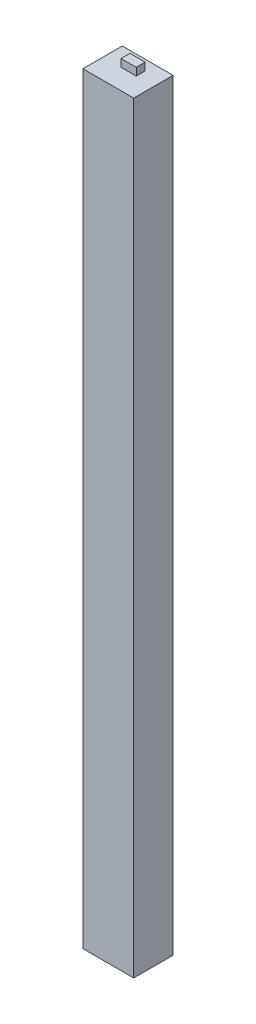
ISO-10303-21;
HEADER;
FILE_DESCRIPTION(('STEP AP214'),'2;1');
FILE_NAME('part.step','',(''),(''),'','','');
FILE_SCHEMA(('AUTOMOTIVE_DESIGN { 1 0 10303 214 1 1 1 1 }'));
ENDSEC;
DATA;
#1=APPLICATION_CONTEXT('core data for automotive mechanical design processes');
#2=APPLICATION_PROTOCOL_DEFINITION('international standard','automotive_design',2000,#1);
#3=PRODUCT_CONTEXT('',#1,'mechanical');
#4=PRODUCT('Part','Part','',(#3));
#5=PRODUCT_RELATED_PRODUCT_CATEGORY('part','',(#4));
#6=PRODUCT_DEFINITION_FORMATION('','',#4);
#7=PRODUCT_DEFINITION_CONTEXT('part definition',#1,'design');
#8=PRODUCT_DEFINITION('design','',#6,#7);
#9=PRODUCT_DEFINITION_SHAPE('','',#8);
#10=(LENGTH_UNIT() NAMED_UNIT(*) SI_UNIT(.MILLI.,.METRE.));
#11=(NAMED_UNIT(*) PLANE_ANGLE_UNIT() SI_UNIT($,.RADIAN.));
#12=(NAMED_UNIT(*) SI_UNIT($,.STERADIAN.) SOLID_ANGLE_UNIT());
#13=UNCERTAINTY_MEASURE_WITH_UNIT(LENGTH_MEASURE(1.E-05),#10,'distance_accuracy_value','');
#14=(GEOMETRIC_REPRESENTATION_CONTEXT(3) GLOBAL_UNCERTAINTY_ASSIGNED_CONTEXT((#13)) GLOBAL_UNIT_ASSIGNED_CONTEXT((#10,
#11,#12)) REPRESENTATION_CONTEXT('',''));
#15=CARTESIAN_POINT('',(0.,0.,0.));
#16=DIRECTION('',(0.,0.,1.));
#17=DIRECTION('',(1.,0.,0.));
#18=AXIS2_PLACEMENT_3D('',#15,#16,#17);
#19=CARTESIAN_POINT('',(-10.,150.,15.5));
#20=DIRECTION('',(0.,-1.,0.));
#21=DIRECTION('',(0.,0.,-1.));
#22=AXIS2_PLACEMENT_3D('',#19,#20,#21);
#23=PLANE('',#22);
#24=DIRECTION('',(-1.,0.,0.));
#25=VECTOR('',#24,1.);
#26=CARTESIAN_POINT('',(-10.,150.,0.));
#27=LINE('',#26,#25);
#28=CARTESIAN_POINT('',(10.,150.,0.));
#29=VERTEX_POINT('',#28);
#30=CARTESIAN_POINT('',(-10.,150.,0.));
#31=VERTEX_POINT('',#30);
#32=EDGE_CURVE('E120',#29,#31,#27,.T.);
#33=ORIENTED_EDGE('',*,*,#32,.T.);
#34=DIRECTION('',(0.,0.,-1.));
#35=VECTOR('',#34,1.);
#36=CARTESIAN_POINT('',(-10.,150.,15.5));
#37=LINE('',#36,#35);
#38=CARTESIAN_POINT('',(-10.,150.,15.5));
#39=VERTEX_POINT('',#38);
#40=EDGE_CURVE('E40',#39,#31,#37,.T.);
#41=ORIENTED_EDGE('',*,*,#40,.F.);
#42=DIRECTION('',(-1.,0.,0.));
#43=VECTOR('',#42,1.);
#44=CARTESIAN_POINT('',(-10.,150.,15.5));
#45=LINE('',#44,#43);
#46=CARTESIAN_POINT('',(10.,150.,15.5));
#47=VERTEX_POINT('',#46);
#48=EDGE_CURVE('E129',#47,#39,#45,.T.);
#49=ORIENTED_EDGE('',*,*,#48,.F.);
#50=DIRECTION('',(0.,0.,-1.));
#51=VECTOR('',#50,1.);
#52=CARTESIAN_POINT('',(10.,150.,15.5));
#53=LINE('',#52,#51);
#54=EDGE_CURVE('E11',#47,#29,#53,.T.);
#55=ORIENTED_EDGE('',*,*,#54,.T.);
#56=EDGE_LOOP('',(#33,#41,#49,#55));
#57=FACE_BOUND('',#56,.T.);
#58=DIRECTION('',(0.,0.,-1.));
#59=VECTOR('',#58,1.);
#60=CARTESIAN_POINT('',(3.,150.,4.));
#61=LINE('',#60,#59);
#62=CARTESIAN_POINT('',(3.,150.,7.5));
#63=VERTEX_POINT('',#62);
#64=CARTESIAN_POINT('',(3.,150.,4.));
#65=VERTEX_POINT('',#64);
#66=EDGE_CURVE('E47',#63,#65,#61,.T.);
#67=ORIENTED_EDGE('',*,*,#66,.F.);
#68=DIRECTION('',(1.,0.,0.));
#69=VECTOR('',#68,1.);
#70=CARTESIAN_POINT('',(-3.,150.,7.5));
#71=LINE('',#70,#69);
#72=CARTESIAN_POINT('',(-3.,150.,7.5));
#73=VERTEX_POINT('',#72);
#74=EDGE_CURVE('E51',#73,#63,#71,.T.);
#75=ORIENTED_EDGE('',*,*,#74,.F.);
#76=DIRECTION('',(0.,0.,1.));
#77=VECTOR('',#76,1.);
#78=CARTESIAN_POINT('',(-3.,150.,4.));
#79=LINE('',#78,#77);
#80=CARTESIAN_POINT('',(-3.,150.,4.));
#81=VERTEX_POINT('',#80);
#82=EDGE_CURVE('E259',#81,#73,#79,.T.);
#83=ORIENTED_EDGE('',*,*,#82,.F.);
#84=DIRECTION('',(-1.,0.,0.));
#85=VECTOR('',#84,1.);
#86=CARTESIAN_POINT('',(-3.,150.,4.));
#87=LINE('',#86,#85);
#88=EDGE_CURVE('E265',#65,#81,#87,.T.);
#89=ORIENTED_EDGE('',*,*,#88,.F.);
#90=EDGE_LOOP('',(#67,#75,#83,#89));
#91=FACE_BOUND('',#90,.T.);
#92=ADVANCED_FACE('F32',(#57,#91),#23,.F.);
#93=CARTESIAN_POINT('',(10.,150.,15.5));
#94=DIRECTION('',(-1.,0.,0.));
#95=DIRECTION('',(0.,-1.,0.));
#96=AXIS2_PLACEMENT_3D('',#93,#94,#95);
#97=PLANE('',#96);
#98=DIRECTION('',(0.,1.,0.));
#99=VECTOR('',#98,1.);
#100=CARTESIAN_POINT('',(10.,150.,0.));
#101=LINE('',#100,#99);
#102=CARTESIAN_POINT('',(10.,-150.,0.));
#103=VERTEX_POINT('',#102);
#104=EDGE_CURVE('E117',#103,#29,#101,.T.);
#105=ORIENTED_EDGE('',*,*,#104,.T.);
#106=ORIENTED_EDGE('',*,*,#54,.F.);
#107=DIRECTION('',(0.,1.,0.));
#108=VECTOR('',#107,1.);
#109=CARTESIAN_POINT('',(10.,150.,15.5));
#110=LINE('',#109,#108);
#111=CARTESIAN_POINT('',(10.,-150.,15.5));
#112=VERTEX_POINT('',#111);
#113=EDGE_CURVE('E126',#112,#47,#110,.T.);
#114=ORIENTED_EDGE('',*,*,#113,.F.);
#115=DIRECTION('',(0.,0.,-1.));
#116=VECTOR('',#115,1.);
#117=CARTESIAN_POINT('',(10.,-150.,15.5));
#118=LINE('',#117,#116);
#119=EDGE_CURVE('E135',#112,#103,#118,.T.);
#120=ORIENTED_EDGE('',*,*,#119,.T.);
#121=EDGE_LOOP('',(#105,#106,#114,#120));
#122=FACE_BOUND('',#121,.T.);
#123=ADVANCED_FACE('F34',(#122),#97,.F.);
#124=CARTESIAN_POINT('',(-10.,150.,15.5));
#125=DIRECTION('',(1.,0.,0.));
#126=DIRECTION('',(0.,1.,0.));
#127=AXIS2_PLACEMENT_3D('',#124,#125,#126);
#128=PLANE('',#127);
#129=DIRECTION('',(0.,-1.,0.));
#130=VECTOR('',#129,1.);
#131=CARTESIAN_POINT('',(-10.,150.,0.));
#132=LINE('',#131,#130);
#133=CARTESIAN_POINT('',(-9.99999999999997,-150.,0.));
#134=VERTEX_POINT('',#133);
#135=EDGE_CURVE('E138',#31,#134,#132,.T.);
#136=ORIENTED_EDGE('',*,*,#135,.T.);
#137=DIRECTION('',(0.,0.,-1.));
#138=VECTOR('',#137,1.);
#139=CARTESIAN_POINT('',(-9.99999999999997,-150.,15.5));
#140=LINE('',#139,#138);
#141=CARTESIAN_POINT('',(-9.99999999999997,-150.,15.5));
#142=VERTEX_POINT('',#141);
#143=EDGE_CURVE('E143',#142,#134,#140,.T.);
#144=ORIENTED_EDGE('',*,*,#143,.F.);
#145=DIRECTION('',(0.,-1.,0.));
#146=VECTOR('',#145,1.);
#147=CARTESIAN_POINT('',(-10.,150.,15.5));
#148=LINE('',#147,#146);
#149=EDGE_CURVE('E132',#39,#142,#148,.T.);
#150=ORIENTED_EDGE('',*,*,#149,.F.);
#151=ORIENTED_EDGE('',*,*,#40,.T.);
#152=EDGE_LOOP('',(#136,#144,#150,#151));
#153=FACE_BOUND('',#152,.T.);
#154=ADVANCED_FACE('F150',(#153),#128,.F.);
#155=CARTESIAN_POINT('',(-9.99999999999997,-150.,15.5));
#156=DIRECTION('',(0.,1.,0.));
#157=DIRECTION('',(0.,0.,1.));
#158=AXIS2_PLACEMENT_3D('',#155,#156,#157);
#159=PLANE('',#158);
#160=DIRECTION('',(1.,0.,0.));
#161=VECTOR('',#160,1.);
#162=CARTESIAN_POINT('',(-9.99999999999997,-150.,0.));
#163=LINE('',#162,#161);
#164=EDGE_CURVE('E130',#134,#103,#163,.T.);
#165=ORIENTED_EDGE('',*,*,#164,.T.);
#166=ORIENTED_EDGE('',*,*,#119,.F.);
#167=DIRECTION('',(1.,0.,0.));
#168=VECTOR('',#167,1.);
#169=CARTESIAN_POINT('',(-9.99999999999997,-150.,15.5));
#170=LINE('',#169,#168);
#171=EDGE_CURVE('E134',#142,#112,#170,.T.);
#172=ORIENTED_EDGE('',*,*,#171,.F.);
#173=ORIENTED_EDGE('',*,*,#143,.T.);
#174=EDGE_LOOP('',(#165,#166,#172,#173));
#175=FACE_BOUND('',#174,.T.);
#176=ADVANCED_FACE('F159',(#175),#159,.F.);
#177=CARTESIAN_POINT('',(0.,0.,15.5));
#178=DIRECTION('',(0.,0.,1.));
#179=DIRECTION('',(1.,0.,0.));
#180=AXIS2_PLACEMENT_3D('',#177,#178,#179);
#181=PLANE('',#180);
#182=ORIENTED_EDGE('',*,*,#113,.T.);
#183=ORIENTED_EDGE('',*,*,#48,.T.);
#184=ORIENTED_EDGE('',*,*,#149,.T.);
#185=ORIENTED_EDGE('',*,*,#171,.T.);
#186=EDGE_LOOP('',(#182,#183,#184,#185));
#187=FACE_BOUND('',#186,.T.);
#188=ADVANCED_FACE('F165',(#187),#181,.T.);
#189=CARTESIAN_POINT('',(0.,0.,0.));
#190=DIRECTION('',(0.,0.,1.));
#191=DIRECTION('',(1.,0.,0.));
#192=AXIS2_PLACEMENT_3D('',#189,#190,#191);
#193=PLANE('',#192);
#194=ORIENTED_EDGE('',*,*,#104,.F.);
#195=ORIENTED_EDGE('',*,*,#164,.F.);
#196=ORIENTED_EDGE('',*,*,#135,.F.);
#197=ORIENTED_EDGE('',*,*,#32,.F.);
#198=EDGE_LOOP('',(#194,#195,#196,#197));
#199=FACE_BOUND('',#198,.T.);
#200=ADVANCED_FACE('F156',(#199),#193,.F.);
#201=CARTESIAN_POINT('',(3.,153.,4.));
#202=DIRECTION('',(-1.,0.,0.));
#203=DIRECTION('',(0.,0.,1.));
#204=AXIS2_PLACEMENT_3D('',#201,#202,#203);
#205=PLANE('',#204);
#206=ORIENTED_EDGE('',*,*,#66,.T.);
#207=DIRECTION('',(0.,-1.,0.));
#208=VECTOR('',#207,1.);
#209=CARTESIAN_POINT('',(3.,153.,4.));
#210=LINE('',#209,#208);
#211=CARTESIAN_POINT('',(3.,153.,4.));
#212=VERTEX_POINT('',#211);
#213=EDGE_CURVE('E100',#212,#65,#210,.T.);
#214=ORIENTED_EDGE('',*,*,#213,.F.);
#215=DIRECTION('',(0.,0.,-1.));
#216=VECTOR('',#215,1.);
#217=CARTESIAN_POINT('',(3.,153.,4.));
#218=LINE('',#217,#216);
#219=CARTESIAN_POINT('',(3.,153.,7.5));
#220=VERTEX_POINT('',#219);
#221=EDGE_CURVE('E106',#220,#212,#218,.T.);
#222=ORIENTED_EDGE('',*,*,#221,.F.);
#223=DIRECTION('',(0.,-1.,0.));
#224=VECTOR('',#223,1.);
#225=CARTESIAN_POINT('',(3.,153.,7.5));
#226=LINE('',#225,#224);
#227=EDGE_CURVE('E257',#220,#63,#226,.T.);
#228=ORIENTED_EDGE('',*,*,#227,.T.);
#229=EDGE_LOOP('',(#206,#214,#222,#228));
#230=FACE_BOUND('',#229,.T.);
#231=ADVANCED_FACE('F116',(#230),#205,.F.);
#232=CARTESIAN_POINT('',(-3.,153.,4.));
#233=DIRECTION('',(0.,0.,1.));
#234=DIRECTION('',(1.,0.,0.));
#235=AXIS2_PLACEMENT_3D('',#232,#233,#234);
#236=PLANE('',#235);
#237=ORIENTED_EDGE('',*,*,#88,.T.);
#238=DIRECTION('',(0.,-1.,0.));
#239=VECTOR('',#238,1.);
#240=CARTESIAN_POINT('',(-3.,153.,4.));
#241=LINE('',#240,#239);
#242=CARTESIAN_POINT('',(-3.,153.,4.));
#243=VERTEX_POINT('',#242);
#244=EDGE_CURVE('E102',#243,#81,#241,.T.);
#245=ORIENTED_EDGE('',*,*,#244,.F.);
#246=DIRECTION('',(-1.,0.,0.));
#247=VECTOR('',#246,1.);
#248=CARTESIAN_POINT('',(-3.,153.,4.));
#249=LINE('',#248,#247);
#250=EDGE_CURVE('E95',#212,#243,#249,.T.);
#251=ORIENTED_EDGE('',*,*,#250,.F.);
#252=ORIENTED_EDGE('',*,*,#213,.T.);
#253=EDGE_LOOP('',(#237,#245,#251,#252));
#254=FACE_BOUND('',#253,.T.);
#255=ADVANCED_FACE('F98',(#254),#236,.F.);
#256=CARTESIAN_POINT('',(-3.,153.,4.));
#257=DIRECTION('',(1.,0.,0.));
#258=DIRECTION('',(0.,0.,-1.));
#259=AXIS2_PLACEMENT_3D('',#256,#257,#258);
#260=PLANE('',#259);
#261=ORIENTED_EDGE('',*,*,#82,.T.);
#262=DIRECTION('',(0.,-1.,0.));
#263=VECTOR('',#262,1.);
#264=CARTESIAN_POINT('',(-3.,153.,7.5));
#265=LINE('',#264,#263);
#266=CARTESIAN_POINT('',(-3.,153.,7.5));
#267=VERTEX_POINT('',#266);
#268=EDGE_CURVE('E122',#267,#73,#265,.T.);
#269=ORIENTED_EDGE('',*,*,#268,.F.);
#270=DIRECTION('',(0.,0.,1.));
#271=VECTOR('',#270,1.);
#272=CARTESIAN_POINT('',(-3.,153.,4.));
#273=LINE('',#272,#271);
#274=EDGE_CURVE('E105',#243,#267,#273,.T.);
#275=ORIENTED_EDGE('',*,*,#274,.F.);
#276=ORIENTED_EDGE('',*,*,#244,.T.);
#277=EDGE_LOOP('',(#261,#269,#275,#276));
#278=FACE_BOUND('',#277,.T.);
#279=ADVANCED_FACE('F183',(#278),#260,.F.);
#280=CARTESIAN_POINT('',(-3.,153.,7.5));
#281=DIRECTION('',(0.,0.,-1.));
#282=DIRECTION('',(-1.,0.,0.));
#283=AXIS2_PLACEMENT_3D('',#280,#281,#282);
#284=PLANE('',#283);
#285=ORIENTED_EDGE('',*,*,#74,.T.);
#286=ORIENTED_EDGE('',*,*,#227,.F.);
#287=DIRECTION('',(1.,0.,0.));
#288=VECTOR('',#287,1.);
#289=CARTESIAN_POINT('',(-3.,153.,7.5));
#290=LINE('',#289,#288);
#291=EDGE_CURVE('E111',#267,#220,#290,.T.);
#292=ORIENTED_EDGE('',*,*,#291,.F.);
#293=ORIENTED_EDGE('',*,*,#268,.T.);
#294=EDGE_LOOP('',(#285,#286,#292,#293));
#295=FACE_BOUND('',#294,.T.);
#296=ADVANCED_FACE('F186',(#295),#284,.F.);
#297=CARTESIAN_POINT('',(0.,153.,0.));
#298=DIRECTION('',(0.,1.,0.));
#299=DIRECTION('',(0.,0.,1.));
#300=AXIS2_PLACEMENT_3D('',#297,#298,#299);
#301=PLANE('',#300);
#302=ORIENTED_EDGE('',*,*,#221,.T.);
#303=ORIENTED_EDGE('',*,*,#250,.T.);
#304=ORIENTED_EDGE('',*,*,#274,.T.);
#305=ORIENTED_EDGE('',*,*,#291,.T.);
#306=EDGE_LOOP('',(#302,#303,#304,#305));
#307=FACE_BOUND('',#306,.T.);
#308=ADVANCED_FACE('F109',(#307),#301,.T.);
#309=CLOSED_SHELL('',(#92,#123,#154,#176,#188,#200,#231,#255,#279,#296,#308));
#310=MANIFOLD_SOLID_BREP('B2',#309);
#311=ADVANCED_BREP_SHAPE_REPRESENTATION('',(#18,#310),#14);
#312=SHAPE_DEFINITION_REPRESENTATION(#9,#311);
ENDSEC;
END-ISO-10303-21;
